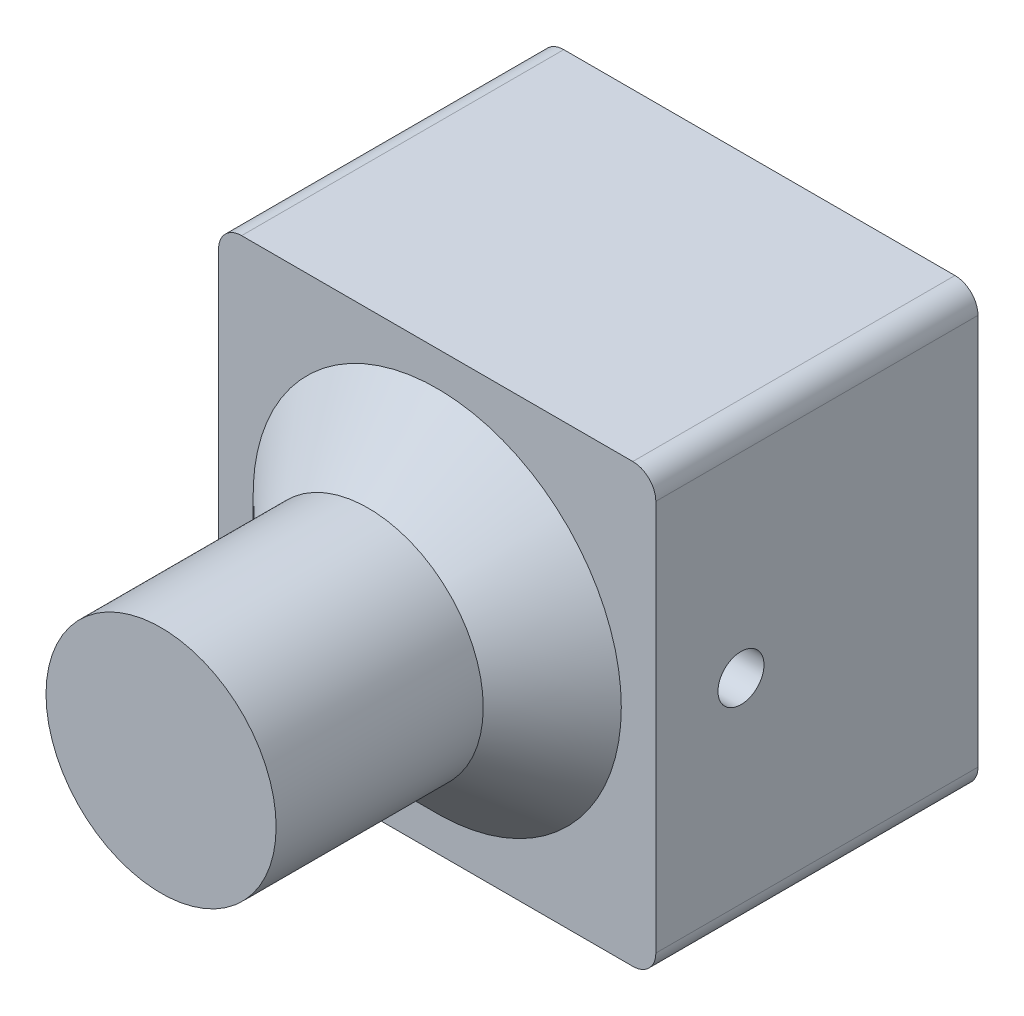
ISO-10303-21;
HEADER;
FILE_DESCRIPTION(('STEP AP214'),'2;1');
FILE_NAME('part.step','',(''),(''),'','','');
FILE_SCHEMA(('AUTOMOTIVE_DESIGN { 1 0 10303 214 1 1 1 1 }'));
ENDSEC;
DATA;
#1=APPLICATION_CONTEXT('core data for automotive mechanical design processes');
#2=APPLICATION_PROTOCOL_DEFINITION('international standard','automotive_design',2000,#1);
#3=PRODUCT_CONTEXT('',#1,'mechanical');
#4=PRODUCT('Part','Part','',(#3));
#5=PRODUCT_RELATED_PRODUCT_CATEGORY('part','',(#4));
#6=PRODUCT_DEFINITION_FORMATION('','',#4);
#7=PRODUCT_DEFINITION_CONTEXT('part definition',#1,'design');
#8=PRODUCT_DEFINITION('design','',#6,#7);
#9=PRODUCT_DEFINITION_SHAPE('','',#8);
#10=(LENGTH_UNIT() NAMED_UNIT(*) SI_UNIT(.MILLI.,.METRE.));
#11=(NAMED_UNIT(*) PLANE_ANGLE_UNIT() SI_UNIT($,.RADIAN.));
#12=(NAMED_UNIT(*) SI_UNIT($,.STERADIAN.) SOLID_ANGLE_UNIT());
#13=UNCERTAINTY_MEASURE_WITH_UNIT(LENGTH_MEASURE(1.E-05),#10,'distance_accuracy_value','');
#14=(GEOMETRIC_REPRESENTATION_CONTEXT(3) GLOBAL_UNCERTAINTY_ASSIGNED_CONTEXT((#13)) GLOBAL_UNIT_ASSIGNED_CONTEXT((#10,
#11,#12)) REPRESENTATION_CONTEXT('',''));
#15=CARTESIAN_POINT('',(0.,0.,0.));
#16=DIRECTION('',(0.,0.,1.));
#17=DIRECTION('',(1.,0.,0.));
#18=AXIS2_PLACEMENT_3D('',#15,#16,#17);
#19=CARTESIAN_POINT('',(56.7274337707558,61.4616075226777,14.));
#20=DIRECTION('',(1.,0.,0.));
#21=DIRECTION('',(0.,1.,0.));
#22=AXIS2_PLACEMENT_3D('',#19,#20,#21);
#23=PLANE('',#22);
#24=CARTESIAN_POINT('',(56.7274337707558,51.9616075226777,10.3));
#25=DIRECTION('',(-1.,0.,0.));
#26=DIRECTION('',(0.,-1.,0.));
#27=AXIS2_PLACEMENT_3D('',#24,#25,#26);
#28=CIRCLE('',#27,1.);
#29=CARTESIAN_POINT('',(56.7274337707558,50.9616075226777,10.3));
#30=VERTEX_POINT('',#29);
#31=EDGE_CURVE('E232',#30,#30,#28,.T.);
#32=ORIENTED_EDGE('',*,*,#31,.F.);
#33=EDGE_LOOP('',(#32));
#34=FACE_BOUND('',#33,.T.);
#35=DIRECTION('',(0.,-1.,0.));
#36=VECTOR('',#35,1.);
#37=CARTESIAN_POINT('',(56.7274337707558,61.4616075226777,0.));
#38=LINE('',#37,#36);
#39=CARTESIAN_POINT('',(56.7274337707558,60.4616075226777,0.));
#40=VERTEX_POINT('',#39);
#41=CARTESIAN_POINT('',(56.7274337707557,43.4616075226777,0.));
#42=VERTEX_POINT('',#41);
#43=EDGE_CURVE('E134',#40,#42,#38,.T.);
#44=ORIENTED_EDGE('',*,*,#43,.T.);
#45=DIRECTION('',(0.,0.,-1.));
#46=VECTOR('',#45,1.);
#47=CARTESIAN_POINT('',(56.7274337707557,43.4616075226777,14.));
#48=LINE('',#47,#46);
#49=CARTESIAN_POINT('',(56.7274337707557,43.4616075226777,14.));
#50=VERTEX_POINT('',#49);
#51=EDGE_CURVE('E156',#42,#50,#48,.F.);
#52=ORIENTED_EDGE('',*,*,#51,.T.);
#53=DIRECTION('',(0.,-1.,0.));
#54=VECTOR('',#53,1.);
#55=CARTESIAN_POINT('',(56.7274337707558,61.4616075226777,14.));
#56=LINE('',#55,#54);
#57=CARTESIAN_POINT('',(56.7274337707558,60.4616075226777,14.));
#58=VERTEX_POINT('',#57);
#59=EDGE_CURVE('E132',#58,#50,#56,.T.);
#60=ORIENTED_EDGE('',*,*,#59,.F.);
#61=DIRECTION('',(0.,0.,-1.));
#62=VECTOR('',#61,1.);
#63=CARTESIAN_POINT('',(56.7274337707558,60.4616075226777,14.));
#64=LINE('',#63,#62);
#65=EDGE_CURVE('E153',#58,#40,#64,.T.);
#66=ORIENTED_EDGE('',*,*,#65,.T.);
#67=EDGE_LOOP('',(#44,#52,#60,#66));
#68=FACE_BOUND('',#67,.T.);
#69=ADVANCED_FACE('F35',(#34,#68),#23,.F.);
#70=CARTESIAN_POINT('',(56.7274337707557,42.4616075226777,14.));
#71=DIRECTION('',(0.,1.,0.));
#72=DIRECTION('',(0.,0.,1.));
#73=AXIS2_PLACEMENT_3D('',#70,#71,#72);
#74=PLANE('',#73);
#75=DIRECTION('',(1.,0.,0.));
#76=VECTOR('',#75,1.);
#77=CARTESIAN_POINT('',(56.7274337707557,42.4616075226777,0.));
#78=LINE('',#77,#76);
#79=CARTESIAN_POINT('',(57.7274337707557,42.4616075226777,0.));
#80=VERTEX_POINT('',#79);
#81=CARTESIAN_POINT('',(74.7274337707558,42.4616075226777,0.));
#82=VERTEX_POINT('',#81);
#83=EDGE_CURVE('E130',#80,#82,#78,.T.);
#84=ORIENTED_EDGE('',*,*,#83,.T.);
#85=DIRECTION('',(0.,0.,-1.));
#86=VECTOR('',#85,1.);
#87=CARTESIAN_POINT('',(74.7274337707558,42.4616075226777,14.));
#88=LINE('',#87,#86);
#89=CARTESIAN_POINT('',(74.7274337707558,42.4616075226777,14.));
#90=VERTEX_POINT('',#89);
#91=EDGE_CURVE('E108',#82,#90,#88,.F.);
#92=ORIENTED_EDGE('',*,*,#91,.T.);
#93=DIRECTION('',(1.,0.,0.));
#94=VECTOR('',#93,1.);
#95=CARTESIAN_POINT('',(56.7274337707557,42.4616075226777,14.));
#96=LINE('',#95,#94);
#97=CARTESIAN_POINT('',(57.7274337707557,42.4616075226777,14.));
#98=VERTEX_POINT('',#97);
#99=EDGE_CURVE('E220',#98,#90,#96,.T.);
#100=ORIENTED_EDGE('',*,*,#99,.F.);
#101=DIRECTION('',(0.,0.,-1.));
#102=VECTOR('',#101,1.);
#103=CARTESIAN_POINT('',(57.7274337707557,42.4616075226777,14.));
#104=LINE('',#103,#102);
#105=EDGE_CURVE('E113',#98,#80,#104,.T.);
#106=ORIENTED_EDGE('',*,*,#105,.T.);
#107=EDGE_LOOP('',(#84,#92,#100,#106));
#108=FACE_BOUND('',#107,.T.);
#109=ADVANCED_FACE('F182',(#108),#74,.F.);
#110=CARTESIAN_POINT('',(75.7274337707558,61.4616075226777,14.));
#111=DIRECTION('',(-1.,0.,0.));
#112=DIRECTION('',(0.,0.,1.));
#113=AXIS2_PLACEMENT_3D('',#110,#111,#112);
#114=PLANE('',#113);
#115=CARTESIAN_POINT('',(75.7274337707558,51.9616075226777,10.3));
#116=DIRECTION('',(1.,0.,0.));
#117=DIRECTION('',(0.,0.,-1.));
#118=AXIS2_PLACEMENT_3D('',#115,#116,#117);
#119=CIRCLE('',#118,1.);
#120=CARTESIAN_POINT('',(75.7274337707558,51.9616075226777,9.3));
#121=VERTEX_POINT('',#120);
#122=EDGE_CURVE('E239',#121,#121,#119,.T.);
#123=ORIENTED_EDGE('',*,*,#122,.F.);
#124=EDGE_LOOP('',(#123));
#125=FACE_BOUND('',#124,.T.);
#126=DIRECTION('',(0.,1.,0.));
#127=VECTOR('',#126,1.);
#128=CARTESIAN_POINT('',(75.7274337707558,61.4616075226777,14.));
#129=LINE('',#128,#127);
#130=CARTESIAN_POINT('',(75.7274337707558,43.4616075226777,14.));
#131=VERTEX_POINT('',#130);
#132=CARTESIAN_POINT('',(75.7274337707558,60.4616075226777,14.));
#133=VERTEX_POINT('',#132);
#134=EDGE_CURVE('E122',#131,#133,#129,.T.);
#135=ORIENTED_EDGE('',*,*,#134,.F.);
#136=DIRECTION('',(0.,0.,-1.));
#137=VECTOR('',#136,1.);
#138=CARTESIAN_POINT('',(75.7274337707558,43.4616075226777,14.));
#139=LINE('',#138,#137);
#140=CARTESIAN_POINT('',(75.7274337707558,43.4616075226777,0.));
#141=VERTEX_POINT('',#140);
#142=EDGE_CURVE('E107',#131,#141,#139,.T.);
#143=ORIENTED_EDGE('',*,*,#142,.T.);
#144=DIRECTION('',(0.,1.,0.));
#145=VECTOR('',#144,1.);
#146=CARTESIAN_POINT('',(75.7274337707558,61.4616075226777,0.));
#147=LINE('',#146,#145);
#148=CARTESIAN_POINT('',(75.7274337707558,60.4616075226777,0.));
#149=VERTEX_POINT('',#148);
#150=EDGE_CURVE('E120',#141,#149,#147,.T.);
#151=ORIENTED_EDGE('',*,*,#150,.T.);
#152=DIRECTION('',(0.,0.,-1.));
#153=VECTOR('',#152,1.);
#154=CARTESIAN_POINT('',(75.7274337707558,60.4616075226777,14.));
#155=LINE('',#154,#153);
#156=EDGE_CURVE('E124',#149,#133,#155,.F.);
#157=ORIENTED_EDGE('',*,*,#156,.T.);
#158=EDGE_LOOP('',(#135,#143,#151,#157));
#159=FACE_BOUND('',#158,.T.);
#160=ADVANCED_FACE('F119',(#125,#159),#114,.F.);
#161=CARTESIAN_POINT('',(56.7274337707558,61.4616075226777,14.));
#162=DIRECTION('',(0.,-1.,0.));
#163=DIRECTION('',(0.,0.,-1.));
#164=AXIS2_PLACEMENT_3D('',#161,#162,#163);
#165=PLANE('',#164);
#166=DIRECTION('',(-1.,0.,0.));
#167=VECTOR('',#166,1.);
#168=CARTESIAN_POINT('',(56.7274337707558,61.4616075226777,14.));
#169=LINE('',#168,#167);
#170=CARTESIAN_POINT('',(74.7274337707558,61.4616075226777,14.));
#171=VERTEX_POINT('',#170);
#172=CARTESIAN_POINT('',(57.7274337707558,61.4616075226777,14.));
#173=VERTEX_POINT('',#172);
#174=EDGE_CURVE('E138',#171,#173,#169,.T.);
#175=ORIENTED_EDGE('',*,*,#174,.F.);
#176=DIRECTION('',(0.,0.,-1.));
#177=VECTOR('',#176,1.);
#178=CARTESIAN_POINT('',(74.7274337707558,61.4616075226777,14.));
#179=LINE('',#178,#177);
#180=CARTESIAN_POINT('',(74.7274337707558,61.4616075226777,0.));
#181=VERTEX_POINT('',#180);
#182=EDGE_CURVE('E159',#171,#181,#179,.T.);
#183=ORIENTED_EDGE('',*,*,#182,.T.);
#184=DIRECTION('',(-1.,0.,0.));
#185=VECTOR('',#184,1.);
#186=CARTESIAN_POINT('',(56.7274337707558,61.4616075226777,0.));
#187=LINE('',#186,#185);
#188=CARTESIAN_POINT('',(57.7274337707558,61.4616075226777,0.));
#189=VERTEX_POINT('',#188);
#190=EDGE_CURVE('E129',#181,#189,#187,.T.);
#191=ORIENTED_EDGE('',*,*,#190,.T.);
#192=DIRECTION('',(0.,0.,-1.));
#193=VECTOR('',#192,1.);
#194=CARTESIAN_POINT('',(57.7274337707558,61.4616075226777,14.));
#195=LINE('',#194,#193);
#196=EDGE_CURVE('E51',#189,#173,#195,.F.);
#197=ORIENTED_EDGE('',*,*,#196,.T.);
#198=EDGE_LOOP('',(#175,#183,#191,#197));
#199=FACE_BOUND('',#198,.T.);
#200=ADVANCED_FACE('F254',(#199),#165,.F.);
#201=CARTESIAN_POINT('',(0.,0.,14.));
#202=DIRECTION('',(0.,0.,1.));
#203=DIRECTION('',(1.,0.,0.));
#204=AXIS2_PLACEMENT_3D('',#201,#202,#203);
#205=PLANE('',#204);
#206=CARTESIAN_POINT('',(66.2274337707558,51.9616075226777,14.));
#207=DIRECTION('',(0.,0.,1.));
#208=DIRECTION('',(1.,0.,0.));
#209=AXIS2_PLACEMENT_3D('',#206,#207,#208);
#210=CIRCLE('',#209,7.99999999999998);
#211=CARTESIAN_POINT('',(74.2274337707557,51.9616075226777,14.));
#212=VERTEX_POINT('',#211);
#213=EDGE_CURVE('E11',#212,#212,#210,.F.);
#214=ORIENTED_EDGE('',*,*,#213,.T.);
#215=EDGE_LOOP('',(#214));
#216=FACE_BOUND('',#215,.T.);
#217=ORIENTED_EDGE('',*,*,#99,.T.);
#218=CARTESIAN_POINT('',(74.7274337707558,43.4616075226777,14.));
#219=DIRECTION('',(0.,0.,1.));
#220=DIRECTION('',(1.,0.,0.));
#221=AXIS2_PLACEMENT_3D('',#218,#219,#220);
#222=CIRCLE('',#221,1.);
#223=EDGE_CURVE('E151',#90,#131,#222,.T.);
#224=ORIENTED_EDGE('',*,*,#223,.T.);
#225=ORIENTED_EDGE('',*,*,#134,.T.);
#226=CARTESIAN_POINT('',(74.7274337707558,60.4616075226777,14.));
#227=DIRECTION('',(0.,0.,1.));
#228=DIRECTION('',(1.,0.,0.));
#229=AXIS2_PLACEMENT_3D('',#226,#227,#228);
#230=CIRCLE('',#229,1.);
#231=EDGE_CURVE('E58',#133,#171,#230,.T.);
#232=ORIENTED_EDGE('',*,*,#231,.T.);
#233=ORIENTED_EDGE('',*,*,#174,.T.);
#234=CARTESIAN_POINT('',(57.7274337707558,60.4616075226777,14.));
#235=DIRECTION('',(0.,0.,1.));
#236=DIRECTION('',(1.,0.,0.));
#237=AXIS2_PLACEMENT_3D('',#234,#235,#236);
#238=CIRCLE('',#237,1.);
#239=EDGE_CURVE('E146',#173,#58,#238,.T.);
#240=ORIENTED_EDGE('',*,*,#239,.T.);
#241=ORIENTED_EDGE('',*,*,#59,.T.);
#242=CARTESIAN_POINT('',(57.7274337707557,43.4616075226777,14.));
#243=DIRECTION('',(0.,0.,1.));
#244=DIRECTION('',(1.,0.,0.));
#245=AXIS2_PLACEMENT_3D('',#242,#243,#244);
#246=CIRCLE('',#245,1.);
#247=EDGE_CURVE('E149',#50,#98,#246,.T.);
#248=ORIENTED_EDGE('',*,*,#247,.T.);
#249=EDGE_LOOP('',(#217,#224,#225,#232,#233,#240,#241,#248));
#250=FACE_BOUND('',#249,.T.);
#251=ADVANCED_FACE('F215',(#216,#250),#205,.T.);
#252=CARTESIAN_POINT('',(0.,0.,0.));
#253=DIRECTION('',(0.,0.,1.));
#254=DIRECTION('',(1.,0.,0.));
#255=AXIS2_PLACEMENT_3D('',#252,#253,#254);
#256=PLANE('',#255);
#257=ORIENTED_EDGE('',*,*,#150,.F.);
#258=CARTESIAN_POINT('',(74.7274337707558,43.4616075226777,0.));
#259=DIRECTION('',(0.,0.,1.));
#260=DIRECTION('',(1.,0.,0.));
#261=AXIS2_PLACEMENT_3D('',#258,#259,#260);
#262=CIRCLE('',#261,1.);
#263=EDGE_CURVE('E103',#141,#82,#262,.F.);
#264=ORIENTED_EDGE('',*,*,#263,.T.);
#265=ORIENTED_EDGE('',*,*,#83,.F.);
#266=CARTESIAN_POINT('',(57.7274337707557,43.4616075226777,0.));
#267=DIRECTION('',(0.,0.,1.));
#268=DIRECTION('',(1.,0.,0.));
#269=AXIS2_PLACEMENT_3D('',#266,#267,#268);
#270=CIRCLE('',#269,1.);
#271=EDGE_CURVE('E114',#80,#42,#270,.F.);
#272=ORIENTED_EDGE('',*,*,#271,.T.);
#273=ORIENTED_EDGE('',*,*,#43,.F.);
#274=CARTESIAN_POINT('',(57.7274337707558,60.4616075226777,0.));
#275=DIRECTION('',(0.,0.,1.));
#276=DIRECTION('',(1.,0.,0.));
#277=AXIS2_PLACEMENT_3D('',#274,#275,#276);
#278=CIRCLE('',#277,1.);
#279=EDGE_CURVE('E123',#40,#189,#278,.F.);
#280=ORIENTED_EDGE('',*,*,#279,.T.);
#281=ORIENTED_EDGE('',*,*,#190,.F.);
#282=CARTESIAN_POINT('',(74.7274337707558,60.4616075226777,0.));
#283=DIRECTION('',(0.,0.,1.));
#284=DIRECTION('',(1.,0.,0.));
#285=AXIS2_PLACEMENT_3D('',#282,#283,#284);
#286=CIRCLE('',#285,1.);
#287=EDGE_CURVE('E128',#181,#149,#286,.F.);
#288=ORIENTED_EDGE('',*,*,#287,.T.);
#289=EDGE_LOOP('',(#257,#264,#265,#272,#273,#280,#281,#288));
#290=FACE_BOUND('',#289,.T.);
#291=ADVANCED_FACE('F126',(#290),#256,.F.);
#292=CARTESIAN_POINT('',(74.7274337707558,43.4616075226777,14.));
#293=DIRECTION('',(0.,0.,-1.));
#294=DIRECTION('',(-1.,0.,0.));
#295=AXIS2_PLACEMENT_3D('',#292,#293,#294);
#296=CYLINDRICAL_SURFACE('',#295,1.);
#297=ORIENTED_EDGE('',*,*,#223,.F.);
#298=ORIENTED_EDGE('',*,*,#91,.F.);
#299=ORIENTED_EDGE('',*,*,#263,.F.);
#300=ORIENTED_EDGE('',*,*,#142,.F.);
#301=EDGE_LOOP('',(#297,#298,#299,#300));
#302=FACE_BOUND('',#301,.T.);
#303=ADVANCED_FACE('F106',(#302),#296,.T.);
#304=CARTESIAN_POINT('',(57.7274337707557,43.4616075226777,14.));
#305=DIRECTION('',(0.,0.,-1.));
#306=DIRECTION('',(-1.,0.,0.));
#307=AXIS2_PLACEMENT_3D('',#304,#305,#306);
#308=CYLINDRICAL_SURFACE('',#307,1.);
#309=ORIENTED_EDGE('',*,*,#247,.F.);
#310=ORIENTED_EDGE('',*,*,#51,.F.);
#311=ORIENTED_EDGE('',*,*,#271,.F.);
#312=ORIENTED_EDGE('',*,*,#105,.F.);
#313=EDGE_LOOP('',(#309,#310,#311,#312));
#314=FACE_BOUND('',#313,.T.);
#315=ADVANCED_FACE('F196',(#314),#308,.T.);
#316=CARTESIAN_POINT('',(74.7274337707558,60.4616075226777,14.));
#317=DIRECTION('',(0.,0.,-1.));
#318=DIRECTION('',(-1.,0.,0.));
#319=AXIS2_PLACEMENT_3D('',#316,#317,#318);
#320=CYLINDRICAL_SURFACE('',#319,1.);
#321=ORIENTED_EDGE('',*,*,#231,.F.);
#322=ORIENTED_EDGE('',*,*,#156,.F.);
#323=ORIENTED_EDGE('',*,*,#287,.F.);
#324=ORIENTED_EDGE('',*,*,#182,.F.);
#325=EDGE_LOOP('',(#321,#322,#323,#324));
#326=FACE_BOUND('',#325,.T.);
#327=ADVANCED_FACE('F199',(#326),#320,.T.);
#328=CARTESIAN_POINT('',(57.7274337707558,60.4616075226777,14.));
#329=DIRECTION('',(0.,0.,-1.));
#330=DIRECTION('',(-1.,0.,0.));
#331=AXIS2_PLACEMENT_3D('',#328,#329,#330);
#332=CYLINDRICAL_SURFACE('',#331,1.);
#333=ORIENTED_EDGE('',*,*,#239,.F.);
#334=ORIENTED_EDGE('',*,*,#196,.F.);
#335=ORIENTED_EDGE('',*,*,#279,.F.);
#336=ORIENTED_EDGE('',*,*,#65,.F.);
#337=EDGE_LOOP('',(#333,#334,#335,#336));
#338=FACE_BOUND('',#337,.T.);
#339=ADVANCED_FACE('F202',(#338),#332,.T.);
#340=CARTESIAN_POINT('',(66.2274337707558,51.9616075226777,26.));
#341=DIRECTION('',(0.,0.,-1.));
#342=DIRECTION('',(-1.,0.,0.));
#343=AXIS2_PLACEMENT_3D('',#340,#341,#342);
#344=CYLINDRICAL_SURFACE('',#343,5.00000000000001);
#345=CARTESIAN_POINT('',(66.2274337707558,51.9616075226777,17.));
#346=DIRECTION('',(0.,0.,1.));
#347=DIRECTION('',(1.,0.,0.));
#348=AXIS2_PLACEMENT_3D('',#345,#346,#347);
#349=CIRCLE('',#348,5.00000000000001);
#350=CARTESIAN_POINT('',(71.2274337707558,51.9616075226777,17.));
#351=VERTEX_POINT('',#350);
#352=EDGE_CURVE('E44',#351,#351,#349,.T.);
#353=ORIENTED_EDGE('',*,*,#352,.T.);
#354=EDGE_LOOP('',(#353));
#355=FACE_BOUND('',#354,.T.);
#356=CARTESIAN_POINT('',(66.2274337707558,51.9616075226777,26.));
#357=DIRECTION('',(0.,0.,1.));
#358=DIRECTION('',(1.,0.,0.));
#359=AXIS2_PLACEMENT_3D('',#356,#357,#358);
#360=CIRCLE('',#359,5.00000000000001);
#361=CARTESIAN_POINT('',(71.2274337707558,51.9616075226777,26.));
#362=VERTEX_POINT('',#361);
#363=EDGE_CURVE('E224',#362,#362,#360,.T.);
#364=ORIENTED_EDGE('',*,*,#363,.F.);
#365=EDGE_LOOP('',(#364));
#366=FACE_BOUND('',#365,.T.);
#367=ADVANCED_FACE('F164',(#355,#366),#344,.T.);
#368=CARTESIAN_POINT('',(66.2274337707558,51.9616075226777,26.));
#369=DIRECTION('',(0.,0.,1.));
#370=DIRECTION('',(1.,0.,0.));
#371=AXIS2_PLACEMENT_3D('',#368,#369,#370);
#372=PLANE('',#371);
#373=ORIENTED_EDGE('',*,*,#363,.T.);
#374=EDGE_LOOP('',(#373));
#375=FACE_BOUND('',#374,.T.);
#376=ADVANCED_FACE('F169',(#375),#372,.T.);
#377=CARTESIAN_POINT('',(66.2274337707558,51.9616075226777,17.));
#378=DIRECTION('',(0.,0.,-1.));
#379=DIRECTION('',(-1.,0.,0.));
#380=AXIS2_PLACEMENT_3D('',#377,#378,#379);
#381=CONICAL_SURFACE('',#380,5.00000000000001,0.785398163397441);
#382=ORIENTED_EDGE('',*,*,#213,.F.);
#383=EDGE_LOOP('',(#382));
#384=FACE_BOUND('',#383,.T.);
#385=ORIENTED_EDGE('',*,*,#352,.F.);
#386=EDGE_LOOP('',(#385));
#387=FACE_BOUND('',#386,.T.);
#388=ADVANCED_FACE('F38',(#384,#387),#381,.T.);
#389=CARTESIAN_POINT('',(61.7274337707558,51.9616075226777,10.3));
#390=DIRECTION('',(-1.,0.,0.));
#391=DIRECTION('',(0.,-1.,0.));
#392=AXIS2_PLACEMENT_3D('',#389,#390,#391);
#393=CYLINDRICAL_SURFACE('',#392,1.);
#394=CARTESIAN_POINT('',(61.7274337707558,51.9616075226777,10.3));
#395=DIRECTION('',(-1.,0.,0.));
#396=DIRECTION('',(0.,-1.,0.));
#397=AXIS2_PLACEMENT_3D('',#394,#395,#396);
#398=CIRCLE('',#397,1.);
#399=CARTESIAN_POINT('',(61.7274337707558,50.9616075226777,10.3));
#400=VERTEX_POINT('',#399);
#401=EDGE_CURVE('E229',#400,#400,#398,.T.);
#402=ORIENTED_EDGE('',*,*,#401,.F.);
#403=EDGE_LOOP('',(#402));
#404=FACE_BOUND('',#403,.T.);
#405=ORIENTED_EDGE('',*,*,#31,.T.);
#406=EDGE_LOOP('',(#405));
#407=FACE_BOUND('',#406,.T.);
#408=ADVANCED_FACE('F168',(#404,#407),#393,.F.);
#409=CARTESIAN_POINT('',(61.7274337707558,51.9616075226777,10.3));
#410=DIRECTION('',(-1.,0.,0.));
#411=DIRECTION('',(0.,-1.,0.));
#412=AXIS2_PLACEMENT_3D('',#409,#410,#411);
#413=PLANE('',#412);
#414=ORIENTED_EDGE('',*,*,#401,.T.);
#415=EDGE_LOOP('',(#414));
#416=FACE_BOUND('',#415,.T.);
#417=ADVANCED_FACE('F175',(#416),#413,.T.);
#418=CARTESIAN_POINT('',(70.7274337707557,51.9616075226777,10.3));
#419=DIRECTION('',(1.,0.,0.));
#420=DIRECTION('',(0.,0.,-1.));
#421=AXIS2_PLACEMENT_3D('',#418,#419,#420);
#422=CYLINDRICAL_SURFACE('',#421,1.);
#423=CARTESIAN_POINT('',(70.7274337707557,51.9616075226777,10.3));
#424=DIRECTION('',(1.,0.,0.));
#425=DIRECTION('',(0.,0.,-1.));
#426=AXIS2_PLACEMENT_3D('',#423,#424,#425);
#427=CIRCLE('',#426,1.);
#428=CARTESIAN_POINT('',(70.7274337707557,51.9616075226777,9.3));
#429=VERTEX_POINT('',#428);
#430=EDGE_CURVE('E237',#429,#429,#427,.T.);
#431=ORIENTED_EDGE('',*,*,#430,.F.);
#432=EDGE_LOOP('',(#431));
#433=FACE_BOUND('',#432,.T.);
#434=ORIENTED_EDGE('',*,*,#122,.T.);
#435=EDGE_LOOP('',(#434));
#436=FACE_BOUND('',#435,.T.);
#437=ADVANCED_FACE('F247',(#433,#436),#422,.F.);
#438=CARTESIAN_POINT('',(70.7274337707557,51.9616075226777,10.3));
#439=DIRECTION('',(1.,0.,0.));
#440=DIRECTION('',(0.,0.,-1.));
#441=AXIS2_PLACEMENT_3D('',#438,#439,#440);
#442=PLANE('',#441);
#443=ORIENTED_EDGE('',*,*,#430,.T.);
#444=EDGE_LOOP('',(#443));
#445=FACE_BOUND('',#444,.T.);
#446=ADVANCED_FACE('F245',(#445),#442,.T.);
#447=CLOSED_SHELL('',(#69,#109,#160,#200,#251,#291,#303,#315,#327,#339,#367,#376,#388,#408,#417,
#437,#446));
#448=MANIFOLD_SOLID_BREP('B2',#447);
#449=ADVANCED_BREP_SHAPE_REPRESENTATION('',(#18,#448),#14);
#450=SHAPE_DEFINITION_REPRESENTATION(#9,#449);
ENDSEC;
END-ISO-10303-21;
